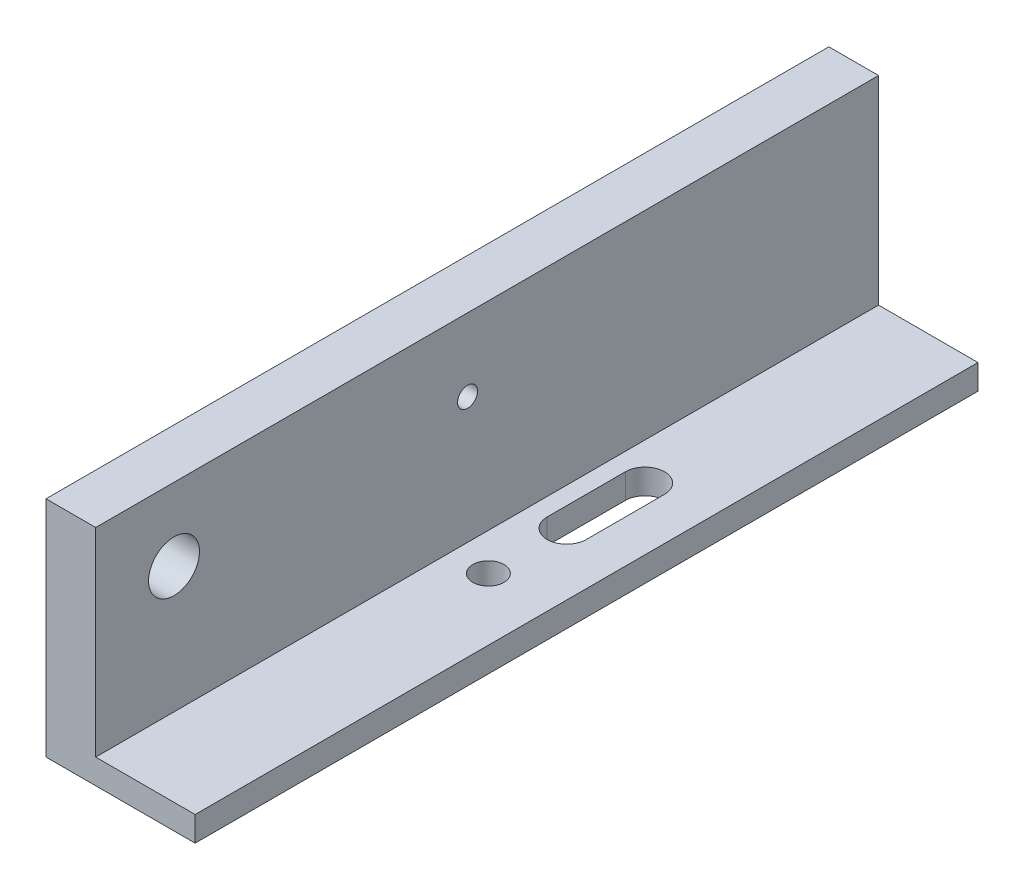
ISO-10303-21;
HEADER;
FILE_DESCRIPTION(('STEP AP214'),'2;1');
FILE_NAME('part.step','',(''),(''),'','','');
FILE_SCHEMA(('AUTOMOTIVE_DESIGN { 1 0 10303 214 1 1 1 1 }'));
ENDSEC;
DATA;
#1=APPLICATION_CONTEXT('core data for automotive mechanical design processes');
#2=APPLICATION_PROTOCOL_DEFINITION('international standard','automotive_design',2000,#1);
#3=PRODUCT_CONTEXT('',#1,'mechanical');
#4=PRODUCT('Part','Part','',(#3));
#5=PRODUCT_RELATED_PRODUCT_CATEGORY('part','',(#4));
#6=PRODUCT_DEFINITION_FORMATION('','',#4);
#7=PRODUCT_DEFINITION_CONTEXT('part definition',#1,'design');
#8=PRODUCT_DEFINITION('design','',#6,#7);
#9=PRODUCT_DEFINITION_SHAPE('','',#8);
#10=(LENGTH_UNIT() NAMED_UNIT(*) SI_UNIT(.MILLI.,.METRE.));
#11=(NAMED_UNIT(*) PLANE_ANGLE_UNIT() SI_UNIT($,.RADIAN.));
#12=(NAMED_UNIT(*) SI_UNIT($,.STERADIAN.) SOLID_ANGLE_UNIT());
#13=UNCERTAINTY_MEASURE_WITH_UNIT(LENGTH_MEASURE(1.E-05),#10,'distance_accuracy_value','');
#14=(GEOMETRIC_REPRESENTATION_CONTEXT(3) GLOBAL_UNCERTAINTY_ASSIGNED_CONTEXT((#13)) GLOBAL_UNIT_ASSIGNED_CONTEXT((#10,
#11,#12)) REPRESENTATION_CONTEXT('',''));
#15=CARTESIAN_POINT('',(0.,0.,0.));
#16=DIRECTION('',(0.,0.,1.));
#17=DIRECTION('',(1.,0.,0.));
#18=AXIS2_PLACEMENT_3D('',#15,#16,#17);
#19=CARTESIAN_POINT('',(0.,0.,100.));
#20=DIRECTION('',(1.,0.,0.));
#21=DIRECTION('',(0.,1.,0.));
#22=AXIS2_PLACEMENT_3D('',#19,#20,#21);
#23=PLANE('',#22);
#24=CARTESIAN_POINT('',(0.,10.,4.9999999999997));
#25=DIRECTION('',(1.,0.,0.));
#26=DIRECTION('',(0.,1.,0.));
#27=AXIS2_PLACEMENT_3D('',#24,#25,#26);
#28=CIRCLE('',#27,2.55269999999999);
#29=CARTESIAN_POINT('',(0.,12.5527,4.9999999999997));
#30=VERTEX_POINT('',#29);
#31=EDGE_CURVE('E307',#30,#30,#28,.T.);
#32=ORIENTED_EDGE('',*,*,#31,.T.);
#33=EDGE_LOOP('',(#32));
#34=FACE_BOUND('',#33,.T.);
#35=CARTESIAN_POINT('',(0.,10.,80.));
#36=DIRECTION('',(-1.,0.,0.));
#37=DIRECTION('',(0.,-1.,0.));
#38=AXIS2_PLACEMENT_3D('',#35,#36,#37);
#39=CIRCLE('',#38,6.5);
#40=CARTESIAN_POINT('',(0.,3.5,80.));
#41=VERTEX_POINT('',#40);
#42=EDGE_CURVE('E172',#41,#41,#39,.T.);
#43=ORIENTED_EDGE('',*,*,#42,.F.);
#44=EDGE_LOOP('',(#43));
#45=FACE_BOUND('',#44,.T.);
#46=DIRECTION('',(0.,-1.,0.));
#47=VECTOR('',#46,1.);
#48=CARTESIAN_POINT('',(0.,6.35,-50.));
#49=LINE('',#48,#47);
#50=CARTESIAN_POINT('',(0.,6.35,-50.));
#51=VERTEX_POINT('',#50);
#52=CARTESIAN_POINT('',(0.,-6.35,-50.));
#53=VERTEX_POINT('',#52);
#54=EDGE_CURVE('E200',#51,#53,#49,.T.);
#55=ORIENTED_EDGE('',*,*,#54,.F.);
#56=DIRECTION('',(0.,0.,-1.));
#57=VECTOR('',#56,1.);
#58=CARTESIAN_POINT('',(0.,6.35,-50.));
#59=LINE('',#58,#57);
#60=CARTESIAN_POINT('',(0.,6.35,50.));
#61=VERTEX_POINT('',#60);
#62=EDGE_CURVE('E197',#61,#51,#59,.T.);
#63=ORIENTED_EDGE('',*,*,#62,.F.);
#64=DIRECTION('',(0.,-1.,0.));
#65=VECTOR('',#64,1.);
#66=CARTESIAN_POINT('',(0.,6.35,50.));
#67=LINE('',#66,#65);
#68=CARTESIAN_POINT('',(0.,-6.35,50.));
#69=VERTEX_POINT('',#68);
#70=EDGE_CURVE('E211',#61,#69,#67,.T.);
#71=ORIENTED_EDGE('',*,*,#70,.T.);
#72=DIRECTION('',(0.,0.,-1.));
#73=VECTOR('',#72,1.);
#74=CARTESIAN_POINT('',(0.,-6.35,-50.));
#75=LINE('',#74,#73);
#76=EDGE_CURVE('E192',#69,#53,#75,.T.);
#77=ORIENTED_EDGE('',*,*,#76,.T.);
#78=EDGE_LOOP('',(#55,#63,#71,#77));
#79=FACE_BOUND('',#78,.T.);
#80=DIRECTION('',(0.,-1.,0.));
#81=VECTOR('',#80,1.);
#82=CARTESIAN_POINT('',(0.,0.,-100.));
#83=LINE('',#82,#81);
#84=CARTESIAN_POINT('',(0.,28.575,-100.));
#85=VERTEX_POINT('',#84);
#86=CARTESIAN_POINT('',(0.,-28.575,-100.));
#87=VERTEX_POINT('',#86);
#88=EDGE_CURVE('E219',#85,#87,#83,.T.);
#89=ORIENTED_EDGE('',*,*,#88,.T.);
#90=DIRECTION('',(0.,0.,-1.));
#91=VECTOR('',#90,1.);
#92=CARTESIAN_POINT('',(0.,-28.575,100.));
#93=LINE('',#92,#91);
#94=CARTESIAN_POINT('',(0.,-28.575,100.));
#95=VERTEX_POINT('',#94);
#96=EDGE_CURVE('E11',#95,#87,#93,.T.);
#97=ORIENTED_EDGE('',*,*,#96,.F.);
#98=DIRECTION('',(0.,-1.,0.));
#99=VECTOR('',#98,1.);
#100=CARTESIAN_POINT('',(0.,0.,100.));
#101=LINE('',#100,#99);
#102=CARTESIAN_POINT('',(0.,28.575,100.));
#103=VERTEX_POINT('',#102);
#104=EDGE_CURVE('E220',#103,#95,#101,.T.);
#105=ORIENTED_EDGE('',*,*,#104,.F.);
#106=DIRECTION('',(0.,0.,-1.));
#107=VECTOR('',#106,1.);
#108=CARTESIAN_POINT('',(0.,28.575,100.));
#109=LINE('',#108,#107);
#110=EDGE_CURVE('E236',#103,#85,#109,.T.);
#111=ORIENTED_EDGE('',*,*,#110,.T.);
#112=EDGE_LOOP('',(#89,#97,#105,#111));
#113=FACE_BOUND('',#112,.T.);
#114=ADVANCED_FACE('F37',(#34,#45,#79,#113),#23,.F.);
#115=CARTESIAN_POINT('',(0.,-28.575,100.));
#116=DIRECTION('',(0.,1.,0.));
#117=DIRECTION('',(-1.,0.,0.));
#118=AXIS2_PLACEMENT_3D('',#115,#116,#117);
#119=PLANE('',#118);
#120=CARTESIAN_POINT('',(22.225,-28.575,9.20496048384081));
#121=DIRECTION('',(0.,-1.,0.));
#122=DIRECTION('',(0.,0.,-1.));
#123=AXIS2_PLACEMENT_3D('',#120,#121,#122);
#124=CIRCLE('',#123,3.96874999999999);
#125=CARTESIAN_POINT('',(22.225,-28.575,5.23621048384083));
#126=VERTEX_POINT('',#125);
#127=EDGE_CURVE('E504',#126,#126,#124,.T.);
#128=ORIENTED_EDGE('',*,*,#127,.F.);
#129=EDGE_LOOP('',(#128));
#130=FACE_BOUND('',#129,.T.);
#131=DIRECTION('',(0.,0.,-1.));
#132=VECTOR('',#131,1.);
#133=CARTESIAN_POINT('',(17.225,-28.575,-10.7950395161592));
#134=LINE('',#133,#132);
#135=CARTESIAN_POINT('',(17.225,-28.575,-10.7950395161592));
#136=VERTEX_POINT('',#135);
#137=CARTESIAN_POINT('',(17.225,-28.575,-30.7900760584101));
#138=VERTEX_POINT('',#137);
#139=EDGE_CURVE('E154',#136,#138,#134,.T.);
#140=ORIENTED_EDGE('',*,*,#139,.F.);
#141=CARTESIAN_POINT('',(22.225,-28.575,-10.7950395161592));
#142=DIRECTION('',(0.,-1.,0.));
#143=DIRECTION('',(1.,0.,0.));
#144=AXIS2_PLACEMENT_3D('',#141,#142,#143);
#145=CIRCLE('',#144,5.);
#146=CARTESIAN_POINT('',(27.225,-28.575,-10.7950395161592));
#147=VERTEX_POINT('',#146);
#148=EDGE_CURVE('E53',#147,#136,#145,.T.);
#149=ORIENTED_EDGE('',*,*,#148,.F.);
#150=DIRECTION('',(0.,0.,1.));
#151=VECTOR('',#150,1.);
#152=CARTESIAN_POINT('',(27.225,-28.575,-10.7950395161592));
#153=LINE('',#152,#151);
#154=CARTESIAN_POINT('',(27.225,-28.575,-30.7900760584101));
#155=VERTEX_POINT('',#154);
#156=EDGE_CURVE('E161',#155,#147,#153,.T.);
#157=ORIENTED_EDGE('',*,*,#156,.F.);
#158=CARTESIAN_POINT('',(22.225,-28.575,-30.7900760584101));
#159=DIRECTION('',(0.,-1.,0.));
#160=DIRECTION('',(1.,0.,0.));
#161=AXIS2_PLACEMENT_3D('',#158,#159,#160);
#162=CIRCLE('',#161,5.);
#163=EDGE_CURVE('E145',#138,#155,#162,.T.);
#164=ORIENTED_EDGE('',*,*,#163,.F.);
#165=EDGE_LOOP('',(#140,#149,#157,#164));
#166=FACE_BOUND('',#165,.T.);
#167=DIRECTION('',(1.,0.,0.));
#168=VECTOR('',#167,1.);
#169=CARTESIAN_POINT('',(0.,-28.575,-100.));
#170=LINE('',#169,#168);
#171=CARTESIAN_POINT('',(38.1,-28.575,-100.));
#172=VERTEX_POINT('',#171);
#173=EDGE_CURVE('E239',#87,#172,#170,.T.);
#174=ORIENTED_EDGE('',*,*,#173,.T.);
#175=DIRECTION('',(0.,0.,-1.));
#176=VECTOR('',#175,1.);
#177=CARTESIAN_POINT('',(38.1,-28.575,100.));
#178=LINE('',#177,#176);
#179=CARTESIAN_POINT('',(38.1,-28.575,100.));
#180=VERTEX_POINT('',#179);
#181=EDGE_CURVE('E45',#180,#172,#178,.T.);
#182=ORIENTED_EDGE('',*,*,#181,.F.);
#183=DIRECTION('',(1.,0.,0.));
#184=VECTOR('',#183,1.);
#185=CARTESIAN_POINT('',(0.,-28.575,100.));
#186=LINE('',#185,#184);
#187=EDGE_CURVE('E223',#95,#180,#186,.T.);
#188=ORIENTED_EDGE('',*,*,#187,.F.);
#189=ORIENTED_EDGE('',*,*,#96,.T.);
#190=EDGE_LOOP('',(#174,#182,#188,#189));
#191=FACE_BOUND('',#190,.T.);
#192=ADVANCED_FACE('F158',(#130,#166,#191),#119,.F.);
#193=CARTESIAN_POINT('',(38.1,0.,100.));
#194=DIRECTION('',(-1.,0.,0.));
#195=DIRECTION('',(0.,0.,1.));
#196=AXIS2_PLACEMENT_3D('',#193,#194,#195);
#197=PLANE('',#196);
#198=DIRECTION('',(0.,1.,0.));
#199=VECTOR('',#198,1.);
#200=CARTESIAN_POINT('',(38.1,0.,-100.));
#201=LINE('',#200,#199);
#202=CARTESIAN_POINT('',(38.1,-22.225,-100.));
#203=VERTEX_POINT('',#202);
#204=EDGE_CURVE('E241',#172,#203,#201,.T.);
#205=ORIENTED_EDGE('',*,*,#204,.T.);
#206=DIRECTION('',(0.,0.,-1.));
#207=VECTOR('',#206,1.);
#208=CARTESIAN_POINT('',(38.1,-22.225,100.));
#209=LINE('',#208,#207);
#210=CARTESIAN_POINT('',(38.1,-22.225,100.));
#211=VERTEX_POINT('',#210);
#212=EDGE_CURVE('E256',#211,#203,#209,.T.);
#213=ORIENTED_EDGE('',*,*,#212,.F.);
#214=DIRECTION('',(0.,1.,0.));
#215=VECTOR('',#214,1.);
#216=CARTESIAN_POINT('',(38.1,0.,100.));
#217=LINE('',#216,#215);
#218=EDGE_CURVE('E226',#180,#211,#217,.T.);
#219=ORIENTED_EDGE('',*,*,#218,.F.);
#220=ORIENTED_EDGE('',*,*,#181,.T.);
#221=EDGE_LOOP('',(#205,#213,#219,#220));
#222=FACE_BOUND('',#221,.T.);
#223=ADVANCED_FACE('F295',(#222),#197,.F.);
#224=CARTESIAN_POINT('',(0.,-22.225,100.));
#225=DIRECTION('',(0.,-1.,0.));
#226=DIRECTION('',(1.,0.,0.));
#227=AXIS2_PLACEMENT_3D('',#224,#225,#226);
#228=PLANE('',#227);
#229=CARTESIAN_POINT('',(22.225,-22.225,9.20496048384081));
#230=DIRECTION('',(0.,-1.,0.));
#231=DIRECTION('',(1.,0.,0.));
#232=AXIS2_PLACEMENT_3D('',#229,#230,#231);
#233=CIRCLE('',#232,3.96874999999999);
#234=CARTESIAN_POINT('',(26.19375,-22.225,9.20496048384081));
#235=VERTEX_POINT('',#234);
#236=EDGE_CURVE('E40',#235,#235,#233,.T.);
#237=ORIENTED_EDGE('',*,*,#236,.T.);
#238=EDGE_LOOP('',(#237));
#239=FACE_BOUND('',#238,.T.);
#240=DIRECTION('',(0.,0.,-1.));
#241=VECTOR('',#240,1.);
#242=CARTESIAN_POINT('',(27.225,-22.225,-10.7950395161592));
#243=LINE('',#242,#241);
#244=CARTESIAN_POINT('',(27.225,-22.225,-10.7950395161592));
#245=VERTEX_POINT('',#244);
#246=CARTESIAN_POINT('',(27.225,-22.225,-30.7900760584101));
#247=VERTEX_POINT('',#246);
#248=EDGE_CURVE('E514',#245,#247,#243,.T.);
#249=ORIENTED_EDGE('',*,*,#248,.F.);
#250=CARTESIAN_POINT('',(22.225,-22.225,-10.7950395161592));
#251=DIRECTION('',(0.,-1.,0.));
#252=DIRECTION('',(1.,0.,0.));
#253=AXIS2_PLACEMENT_3D('',#250,#251,#252);
#254=CIRCLE('',#253,5.);
#255=CARTESIAN_POINT('',(17.225,-22.225,-10.7950395161592));
#256=VERTEX_POINT('',#255);
#257=EDGE_CURVE('E173',#256,#245,#254,.F.);
#258=ORIENTED_EDGE('',*,*,#257,.F.);
#259=DIRECTION('',(0.,0.,1.));
#260=VECTOR('',#259,1.);
#261=CARTESIAN_POINT('',(17.225,-22.225,-10.7950395161592));
#262=LINE('',#261,#260);
#263=CARTESIAN_POINT('',(17.225,-22.225,-30.7900760584101));
#264=VERTEX_POINT('',#263);
#265=EDGE_CURVE('E170',#264,#256,#262,.T.);
#266=ORIENTED_EDGE('',*,*,#265,.F.);
#267=CARTESIAN_POINT('',(22.225,-22.225,-30.7900760584101));
#268=DIRECTION('',(0.,-1.,0.));
#269=DIRECTION('',(1.,0.,0.));
#270=AXIS2_PLACEMENT_3D('',#267,#268,#269);
#271=CIRCLE('',#270,5.);
#272=EDGE_CURVE('E148',#247,#264,#271,.F.);
#273=ORIENTED_EDGE('',*,*,#272,.F.);
#274=EDGE_LOOP('',(#249,#258,#266,#273));
#275=FACE_BOUND('',#274,.T.);
#276=DIRECTION('',(-1.,0.,0.));
#277=VECTOR('',#276,1.);
#278=CARTESIAN_POINT('',(0.,-22.225,-100.));
#279=LINE('',#278,#277);
#280=CARTESIAN_POINT('',(12.7,-22.225,-100.));
#281=VERTEX_POINT('',#280);
#282=EDGE_CURVE('E243',#203,#281,#279,.T.);
#283=ORIENTED_EDGE('',*,*,#282,.T.);
#284=DIRECTION('',(0.,0.,-1.));
#285=VECTOR('',#284,1.);
#286=CARTESIAN_POINT('',(12.7,-22.225,100.));
#287=LINE('',#286,#285);
#288=CARTESIAN_POINT('',(12.7,-22.225,100.));
#289=VERTEX_POINT('',#288);
#290=EDGE_CURVE('E254',#289,#281,#287,.T.);
#291=ORIENTED_EDGE('',*,*,#290,.F.);
#292=DIRECTION('',(-1.,0.,0.));
#293=VECTOR('',#292,1.);
#294=CARTESIAN_POINT('',(0.,-22.225,100.));
#295=LINE('',#294,#293);
#296=EDGE_CURVE('E228',#211,#289,#295,.T.);
#297=ORIENTED_EDGE('',*,*,#296,.F.);
#298=ORIENTED_EDGE('',*,*,#212,.T.);
#299=EDGE_LOOP('',(#283,#291,#297,#298));
#300=FACE_BOUND('',#299,.T.);
#301=ADVANCED_FACE('F272',(#239,#275,#300),#228,.F.);
#302=CARTESIAN_POINT('',(12.7,0.,100.));
#303=DIRECTION('',(1.,0.,0.));
#304=DIRECTION('',(0.,1.,0.));
#305=AXIS2_PLACEMENT_3D('',#302,#303,#304);
#306=PLANE('',#305);
#307=CARTESIAN_POINT('',(12.7,10.,4.9999999999997));
#308=DIRECTION('',(1.,0.,0.));
#309=DIRECTION('',(0.,0.,-1.));
#310=AXIS2_PLACEMENT_3D('',#307,#308,#309);
#311=CIRCLE('',#310,2.55269999999999);
#312=CARTESIAN_POINT('',(12.7,10.,2.44729999999971));
#313=VERTEX_POINT('',#312);
#314=EDGE_CURVE('E507',#313,#313,#311,.T.);
#315=ORIENTED_EDGE('',*,*,#314,.F.);
#316=EDGE_LOOP('',(#315));
#317=FACE_BOUND('',#316,.T.);
#318=CARTESIAN_POINT('',(12.7,10.,80.));
#319=DIRECTION('',(1.,0.,0.));
#320=DIRECTION('',(0.,1.,0.));
#321=AXIS2_PLACEMENT_3D('',#318,#319,#320);
#322=CIRCLE('',#321,6.5);
#323=CARTESIAN_POINT('',(12.7,16.5,80.));
#324=VERTEX_POINT('',#323);
#325=EDGE_CURVE('E176',#324,#324,#322,.T.);
#326=ORIENTED_EDGE('',*,*,#325,.F.);
#327=EDGE_LOOP('',(#326));
#328=FACE_BOUND('',#327,.T.);
#329=DIRECTION('',(0.,-1.,0.));
#330=VECTOR('',#329,1.);
#331=CARTESIAN_POINT('',(12.7,0.,-100.));
#332=LINE('',#331,#330);
#333=CARTESIAN_POINT('',(12.7,28.575,-100.));
#334=VERTEX_POINT('',#333);
#335=EDGE_CURVE('E246',#334,#281,#332,.T.);
#336=ORIENTED_EDGE('',*,*,#335,.F.);
#337=DIRECTION('',(0.,0.,-1.));
#338=VECTOR('',#337,1.);
#339=CARTESIAN_POINT('',(12.7,28.575,100.));
#340=LINE('',#339,#338);
#341=CARTESIAN_POINT('',(12.7,28.575,100.));
#342=VERTEX_POINT('',#341);
#343=EDGE_CURVE('E252',#342,#334,#340,.T.);
#344=ORIENTED_EDGE('',*,*,#343,.F.);
#345=DIRECTION('',(0.,-1.,0.));
#346=VECTOR('',#345,1.);
#347=CARTESIAN_POINT('',(12.7,0.,100.));
#348=LINE('',#347,#346);
#349=EDGE_CURVE('E230',#342,#289,#348,.T.);
#350=ORIENTED_EDGE('',*,*,#349,.T.);
#351=ORIENTED_EDGE('',*,*,#290,.T.);
#352=EDGE_LOOP('',(#336,#344,#350,#351));
#353=FACE_BOUND('',#352,.T.);
#354=ADVANCED_FACE('F268',(#317,#328,#353),#306,.T.);
#355=CARTESIAN_POINT('',(0.,28.575,100.));
#356=DIRECTION('',(0.,1.,0.));
#357=DIRECTION('',(0.,0.,1.));
#358=AXIS2_PLACEMENT_3D('',#355,#356,#357);
#359=PLANE('',#358);
#360=DIRECTION('',(1.,0.,0.));
#361=VECTOR('',#360,1.);
#362=CARTESIAN_POINT('',(0.,28.575,-100.));
#363=LINE('',#362,#361);
#364=EDGE_CURVE('E224',#85,#334,#363,.T.);
#365=ORIENTED_EDGE('',*,*,#364,.F.);
#366=ORIENTED_EDGE('',*,*,#110,.F.);
#367=DIRECTION('',(1.,0.,0.));
#368=VECTOR('',#367,1.);
#369=CARTESIAN_POINT('',(0.,28.575,100.));
#370=LINE('',#369,#368);
#371=EDGE_CURVE('E233',#103,#342,#370,.T.);
#372=ORIENTED_EDGE('',*,*,#371,.T.);
#373=ORIENTED_EDGE('',*,*,#343,.T.);
#374=EDGE_LOOP('',(#365,#366,#372,#373));
#375=FACE_BOUND('',#374,.T.);
#376=ADVANCED_FACE('F271',(#375),#359,.T.);
#377=CARTESIAN_POINT('',(0.,0.,100.));
#378=DIRECTION('',(0.,0.,1.));
#379=DIRECTION('',(1.,0.,0.));
#380=AXIS2_PLACEMENT_3D('',#377,#378,#379);
#381=PLANE('',#380);
#382=ORIENTED_EDGE('',*,*,#104,.T.);
#383=ORIENTED_EDGE('',*,*,#187,.T.);
#384=ORIENTED_EDGE('',*,*,#218,.T.);
#385=ORIENTED_EDGE('',*,*,#296,.T.);
#386=ORIENTED_EDGE('',*,*,#349,.F.);
#387=ORIENTED_EDGE('',*,*,#371,.F.);
#388=EDGE_LOOP('',(#382,#383,#384,#385,#386,#387));
#389=FACE_BOUND('',#388,.T.);
#390=ADVANCED_FACE('F287',(#389),#381,.T.);
#391=CARTESIAN_POINT('',(0.,0.,-100.));
#392=DIRECTION('',(0.,0.,1.));
#393=DIRECTION('',(1.,0.,0.));
#394=AXIS2_PLACEMENT_3D('',#391,#392,#393);
#395=PLANE('',#394);
#396=ORIENTED_EDGE('',*,*,#88,.F.);
#397=ORIENTED_EDGE('',*,*,#364,.T.);
#398=ORIENTED_EDGE('',*,*,#335,.T.);
#399=ORIENTED_EDGE('',*,*,#282,.F.);
#400=ORIENTED_EDGE('',*,*,#204,.F.);
#401=ORIENTED_EDGE('',*,*,#173,.F.);
#402=EDGE_LOOP('',(#396,#397,#398,#399,#400,#401));
#403=FACE_BOUND('',#402,.T.);
#404=ADVANCED_FACE('F282',(#403),#395,.F.);
#405=CARTESIAN_POINT('',(-19.05,6.35,-30.9499999999998));
#406=DIRECTION('',(0.707106781186552,0.,0.707106781186543));
#407=DIRECTION('',(0.707106781186543,0.,-0.707106781186552));
#408=AXIS2_PLACEMENT_3D('',#405,#406,#407);
#409=PLANE('',#408);
#410=CARTESIAN_POINT('',(-9.525,0.,-40.4749999999999));
#411=DIRECTION('',(0.707106781186552,0.,0.707106781186543));
#412=DIRECTION('',(-0.707106781186543,0.,0.707106781186552));
#413=AXIS2_PLACEMENT_3D('',#410,#411,#412);
#414=ELLIPSE('',#413,3.61006296066979,2.55269999999998);
#415=CARTESIAN_POINT('',(-12.0777,0.,-37.9222999999999));
#416=VERTEX_POINT('',#415);
#417=EDGE_CURVE('E184',#416,#416,#414,.T.);
#418=ORIENTED_EDGE('',*,*,#417,.T.);
#419=EDGE_LOOP('',(#418));
#420=FACE_BOUND('',#419,.T.);
#421=DIRECTION('',(-0.707106781186543,0.,0.707106781186552));
#422=VECTOR('',#421,1.);
#423=CARTESIAN_POINT('',(-19.05,-6.35,-30.9499999999998));
#424=LINE('',#423,#422);
#425=CARTESIAN_POINT('',(-19.05,-6.35,-30.9499999999998));
#426=VERTEX_POINT('',#425);
#427=EDGE_CURVE('E187',#53,#426,#424,.T.);
#428=ORIENTED_EDGE('',*,*,#427,.T.);
#429=DIRECTION('',(0.,-1.,0.));
#430=VECTOR('',#429,1.);
#431=CARTESIAN_POINT('',(-19.05,6.35,-30.9499999999998));
#432=LINE('',#431,#430);
#433=CARTESIAN_POINT('',(-19.05,6.35,-30.9499999999998));
#434=VERTEX_POINT('',#433);
#435=EDGE_CURVE('E216',#434,#426,#432,.T.);
#436=ORIENTED_EDGE('',*,*,#435,.F.);
#437=DIRECTION('',(-0.707106781186543,0.,0.707106781186552));
#438=VECTOR('',#437,1.);
#439=CARTESIAN_POINT('',(-19.05,6.35,-30.9499999999998));
#440=LINE('',#439,#438);
#441=EDGE_CURVE('E188',#51,#434,#440,.T.);
#442=ORIENTED_EDGE('',*,*,#441,.F.);
#443=ORIENTED_EDGE('',*,*,#54,.T.);
#444=EDGE_LOOP('',(#428,#436,#442,#443));
#445=FACE_BOUND('',#444,.T.);
#446=ADVANCED_FACE('F319',(#420,#445),#409,.F.);
#447=CARTESIAN_POINT('',(-19.05,6.35,30.9500000000732));
#448=DIRECTION('',(1.,0.,0.));
#449=DIRECTION('',(0.,0.,-1.));
#450=AXIS2_PLACEMENT_3D('',#447,#448,#449);
#451=PLANE('',#450);
#452=CARTESIAN_POINT('',(-19.05,0.,0.));
#453=DIRECTION('',(-1.,0.,0.));
#454=DIRECTION('',(0.,0.,1.));
#455=AXIS2_PLACEMENT_3D('',#452,#453,#454);
#456=CIRCLE('',#455,1.7272);
#457=CARTESIAN_POINT('',(-19.05,0.,1.7272));
#458=VERTEX_POINT('',#457);
#459=EDGE_CURVE('E177',#458,#458,#456,.T.);
#460=ORIENTED_EDGE('',*,*,#459,.F.);
#461=EDGE_LOOP('',(#460));
#462=FACE_BOUND('',#461,.T.);
#463=DIRECTION('',(0.,0.,1.));
#464=VECTOR('',#463,1.);
#465=CARTESIAN_POINT('',(-19.05,-6.35,30.9500000000732));
#466=LINE('',#465,#464);
#467=CARTESIAN_POINT('',(-19.05,-6.35,30.9500000000732));
#468=VERTEX_POINT('',#467);
#469=EDGE_CURVE('E203',#426,#468,#466,.T.);
#470=ORIENTED_EDGE('',*,*,#469,.T.);
#471=DIRECTION('',(0.,-1.,0.));
#472=VECTOR('',#471,1.);
#473=CARTESIAN_POINT('',(-19.05,6.35,30.9500000000732));
#474=LINE('',#473,#472);
#475=CARTESIAN_POINT('',(-19.05,6.35,30.9500000000732));
#476=VERTEX_POINT('',#475);
#477=EDGE_CURVE('E213',#476,#468,#474,.T.);
#478=ORIENTED_EDGE('',*,*,#477,.F.);
#479=DIRECTION('',(0.,0.,1.));
#480=VECTOR('',#479,1.);
#481=CARTESIAN_POINT('',(-19.05,6.35,30.9500000000732));
#482=LINE('',#481,#480);
#483=EDGE_CURVE('E191',#434,#476,#482,.T.);
#484=ORIENTED_EDGE('',*,*,#483,.F.);
#485=ORIENTED_EDGE('',*,*,#435,.T.);
#486=EDGE_LOOP('',(#470,#478,#484,#485));
#487=FACE_BOUND('',#486,.T.);
#488=ADVANCED_FACE('F321',(#462,#487),#451,.F.);
#489=CARTESIAN_POINT('',(0.,6.35,50.));
#490=DIRECTION('',(0.707106781185188,0.,-0.707106781187907));
#491=DIRECTION('',(-0.707106781187907,0.,-0.707106781185188));
#492=AXIS2_PLACEMENT_3D('',#489,#490,#491);
#493=PLANE('',#492);
#494=CARTESIAN_POINT('',(-9.525,0.,40.4750000000366));
#495=DIRECTION('',(0.707106781185188,0.,-0.707106781187907));
#496=DIRECTION('',(0.707106781187907,0.,0.707106781185188));
#497=AXIS2_PLACEMENT_3D('',#494,#495,#496);
#498=ELLIPSE('',#497,3.61006296066283,2.55269999999998);
#499=CARTESIAN_POINT('',(-6.97230000000002,0.,43.0277000000268));
#500=VERTEX_POINT('',#499);
#501=EDGE_CURVE('E183',#500,#500,#498,.T.);
#502=ORIENTED_EDGE('',*,*,#501,.T.);
#503=EDGE_LOOP('',(#502));
#504=FACE_BOUND('',#503,.T.);
#505=DIRECTION('',(0.707106781187907,0.,0.707106781185188));
#506=VECTOR('',#505,1.);
#507=CARTESIAN_POINT('',(0.,-6.35,50.));
#508=LINE('',#507,#506);
#509=EDGE_CURVE('E205',#468,#69,#508,.T.);
#510=ORIENTED_EDGE('',*,*,#509,.T.);
#511=ORIENTED_EDGE('',*,*,#70,.F.);
#512=DIRECTION('',(0.707106781187907,0.,0.707106781185188));
#513=VECTOR('',#512,1.);
#514=CARTESIAN_POINT('',(0.,6.35,50.));
#515=LINE('',#514,#513);
#516=EDGE_CURVE('E194',#476,#61,#515,.T.);
#517=ORIENTED_EDGE('',*,*,#516,.F.);
#518=ORIENTED_EDGE('',*,*,#477,.T.);
#519=EDGE_LOOP('',(#510,#511,#517,#518));
#520=FACE_BOUND('',#519,.T.);
#521=ADVANCED_FACE('F325',(#504,#520),#493,.F.);
#522=CARTESIAN_POINT('',(0.,6.35,0.));
#523=DIRECTION('',(0.,1.,0.));
#524=DIRECTION('',(0.,0.,1.));
#525=AXIS2_PLACEMENT_3D('',#522,#523,#524);
#526=PLANE('',#525);
#527=ORIENTED_EDGE('',*,*,#441,.T.);
#528=ORIENTED_EDGE('',*,*,#483,.T.);
#529=ORIENTED_EDGE('',*,*,#516,.T.);
#530=ORIENTED_EDGE('',*,*,#62,.T.);
#531=EDGE_LOOP('',(#527,#528,#529,#530));
#532=FACE_BOUND('',#531,.T.);
#533=ADVANCED_FACE('F315',(#532),#526,.T.);
#534=CARTESIAN_POINT('',(0.,-6.35,0.));
#535=DIRECTION('',(0.,1.,0.));
#536=DIRECTION('',(0.,0.,1.));
#537=AXIS2_PLACEMENT_3D('',#534,#535,#536);
#538=PLANE('',#537);
#539=ORIENTED_EDGE('',*,*,#427,.F.);
#540=ORIENTED_EDGE('',*,*,#76,.F.);
#541=ORIENTED_EDGE('',*,*,#509,.F.);
#542=ORIENTED_EDGE('',*,*,#469,.F.);
#543=EDGE_LOOP('',(#539,#540,#541,#542));
#544=FACE_BOUND('',#543,.T.);
#545=ADVANCED_FACE('F327',(#544),#538,.F.);
#546=CARTESIAN_POINT('',(-9.525,0.,50.));
#547=DIRECTION('',(0.,0.,1.));
#548=DIRECTION('',(1.,0.,0.));
#549=AXIS2_PLACEMENT_3D('',#546,#547,#548);
#550=CYLINDRICAL_SURFACE('',#549,2.55269999999998);
#551=ORIENTED_EDGE('',*,*,#501,.F.);
#552=EDGE_LOOP('',(#551));
#553=FACE_BOUND('',#552,.T.);
#554=ORIENTED_EDGE('',*,*,#417,.F.);
#555=EDGE_LOOP('',(#554));
#556=FACE_BOUND('',#555,.T.);
#557=ADVANCED_FACE('F329',(#553,#556),#550,.F.);
#558=CARTESIAN_POINT('',(-14.2875,0.,0.));
#559=DIRECTION('',(-1.,0.,0.));
#560=DIRECTION('',(0.,0.,1.));
#561=AXIS2_PLACEMENT_3D('',#558,#559,#560);
#562=CONICAL_SURFACE('',#561,1.7272,1.02974425867665);
#563=CARTESIAN_POINT('',(-13.2496935388156,0.,0.));
#564=VERTEX_POINT('',#563);
#565=VERTEX_LOOP('',#564);
#566=FACE_BOUND('',#565,.T.);
#567=CARTESIAN_POINT('',(-14.2875,0.,0.));
#568=DIRECTION('',(-1.,0.,0.));
#569=DIRECTION('',(0.,0.,1.));
#570=AXIS2_PLACEMENT_3D('',#567,#568,#569);
#571=CIRCLE('',#570,1.7272);
#572=CARTESIAN_POINT('',(-14.2875,0.,1.7272));
#573=VERTEX_POINT('',#572);
#574=EDGE_CURVE('E180',#573,#573,#571,.T.);
#575=ORIENTED_EDGE('',*,*,#574,.T.);
#576=EDGE_LOOP('',(#575));
#577=FACE_BOUND('',#576,.T.);
#578=ADVANCED_FACE('F335',(#566,#577),#562,.F.);
#579=CARTESIAN_POINT('',(-19.05,0.,0.));
#580=DIRECTION('',(-1.,0.,0.));
#581=DIRECTION('',(0.,0.,1.));
#582=AXIS2_PLACEMENT_3D('',#579,#580,#581);
#583=CYLINDRICAL_SURFACE('',#582,1.7272);
#584=ORIENTED_EDGE('',*,*,#574,.F.);
#585=EDGE_LOOP('',(#584));
#586=FACE_BOUND('',#585,.T.);
#587=ORIENTED_EDGE('',*,*,#459,.T.);
#588=EDGE_LOOP('',(#587));
#589=FACE_BOUND('',#588,.T.);
#590=ADVANCED_FACE('F421',(#586,#589),#583,.F.);
#591=CARTESIAN_POINT('',(38.1,10.,80.));
#592=DIRECTION('',(-1.,0.,0.));
#593=DIRECTION('',(0.,-1.,0.));
#594=AXIS2_PLACEMENT_3D('',#591,#592,#593);
#595=CYLINDRICAL_SURFACE('',#594,6.5);
#596=ORIENTED_EDGE('',*,*,#325,.T.);
#597=EDGE_LOOP('',(#596));
#598=FACE_BOUND('',#597,.T.);
#599=ORIENTED_EDGE('',*,*,#42,.T.);
#600=EDGE_LOOP('',(#599));
#601=FACE_BOUND('',#600,.T.);
#602=ADVANCED_FACE('F265',(#598,#601),#595,.F.);
#603=CARTESIAN_POINT('',(22.225,9.39306789117531,-10.7950395161592));
#604=DIRECTION('',(0.,-1.,0.));
#605=DIRECTION('',(1.,0.,0.));
#606=AXIS2_PLACEMENT_3D('',#603,#604,#605);
#607=CYLINDRICAL_SURFACE('',#606,5.);
#608=ORIENTED_EDGE('',*,*,#257,.T.);
#609=DIRECTION('',(0.,-1.,0.));
#610=VECTOR('',#609,1.);
#611=CARTESIAN_POINT('',(27.225,9.39306789117531,-10.7950395161592));
#612=LINE('',#611,#610);
#613=EDGE_CURVE('E166',#245,#147,#612,.T.);
#614=ORIENTED_EDGE('',*,*,#613,.T.);
#615=ORIENTED_EDGE('',*,*,#148,.T.);
#616=DIRECTION('',(0.,-1.,0.));
#617=VECTOR('',#616,1.);
#618=CARTESIAN_POINT('',(17.225,9.39306789117531,-10.7950395161592));
#619=LINE('',#618,#617);
#620=EDGE_CURVE('E151',#256,#136,#619,.T.);
#621=ORIENTED_EDGE('',*,*,#620,.F.);
#622=EDGE_LOOP('',(#608,#614,#615,#621));
#623=FACE_BOUND('',#622,.T.);
#624=ADVANCED_FACE('F438',(#623),#607,.F.);
#625=CARTESIAN_POINT('',(27.225,9.39306789117531,-10.7950395161592));
#626=DIRECTION('',(1.,0.,0.));
#627=DIRECTION('',(0.,0.,-1.));
#628=AXIS2_PLACEMENT_3D('',#625,#626,#627);
#629=PLANE('',#628);
#630=ORIENTED_EDGE('',*,*,#248,.T.);
#631=DIRECTION('',(0.,-1.,0.));
#632=VECTOR('',#631,1.);
#633=CARTESIAN_POINT('',(27.225,9.39306789117531,-30.7900760584101));
#634=LINE('',#633,#632);
#635=EDGE_CURVE('E150',#247,#155,#634,.T.);
#636=ORIENTED_EDGE('',*,*,#635,.T.);
#637=ORIENTED_EDGE('',*,*,#156,.T.);
#638=ORIENTED_EDGE('',*,*,#613,.F.);
#639=EDGE_LOOP('',(#630,#636,#637,#638));
#640=FACE_BOUND('',#639,.T.);
#641=ADVANCED_FACE('F446',(#640),#629,.F.);
#642=CARTESIAN_POINT('',(22.225,9.39306789117531,-30.7900760584101));
#643=DIRECTION('',(0.,-1.,0.));
#644=DIRECTION('',(1.,0.,0.));
#645=AXIS2_PLACEMENT_3D('',#642,#643,#644);
#646=CYLINDRICAL_SURFACE('',#645,5.);
#647=ORIENTED_EDGE('',*,*,#272,.T.);
#648=DIRECTION('',(0.,-1.,0.));
#649=VECTOR('',#648,1.);
#650=CARTESIAN_POINT('',(17.225,9.39306789117531,-30.7900760584101));
#651=LINE('',#650,#649);
#652=EDGE_CURVE('E61',#264,#138,#651,.T.);
#653=ORIENTED_EDGE('',*,*,#652,.T.);
#654=ORIENTED_EDGE('',*,*,#163,.T.);
#655=ORIENTED_EDGE('',*,*,#635,.F.);
#656=EDGE_LOOP('',(#647,#653,#654,#655));
#657=FACE_BOUND('',#656,.T.);
#658=ADVANCED_FACE('F142',(#657),#646,.F.);
#659=CARTESIAN_POINT('',(17.225,9.39306789117531,-10.7950395161592));
#660=DIRECTION('',(-1.,0.,0.));
#661=DIRECTION('',(0.,-1.,0.));
#662=AXIS2_PLACEMENT_3D('',#659,#660,#661);
#663=PLANE('',#662);
#664=ORIENTED_EDGE('',*,*,#265,.T.);
#665=ORIENTED_EDGE('',*,*,#620,.T.);
#666=ORIENTED_EDGE('',*,*,#139,.T.);
#667=ORIENTED_EDGE('',*,*,#652,.F.);
#668=EDGE_LOOP('',(#664,#665,#666,#667));
#669=FACE_BOUND('',#668,.T.);
#670=ADVANCED_FACE('F155',(#669),#663,.F.);
#671=CARTESIAN_POINT('',(12.7,10.,4.9999999999997));
#672=DIRECTION('',(1.,0.,0.));
#673=DIRECTION('',(0.,0.,-1.));
#674=AXIS2_PLACEMENT_3D('',#671,#672,#673);
#675=CYLINDRICAL_SURFACE('',#674,2.55269999999999);
#676=ORIENTED_EDGE('',*,*,#314,.T.);
#677=EDGE_LOOP('',(#676));
#678=FACE_BOUND('',#677,.T.);
#679=ORIENTED_EDGE('',*,*,#31,.F.);
#680=EDGE_LOOP('',(#679));
#681=FACE_BOUND('',#680,.T.);
#682=ADVANCED_FACE('F469',(#678,#681),#675,.F.);
#683=CARTESIAN_POINT('',(22.225,-28.575,9.20496048384081));
#684=DIRECTION('',(0.,-1.,0.));
#685=DIRECTION('',(0.,0.,-1.));
#686=AXIS2_PLACEMENT_3D('',#683,#684,#685);
#687=CYLINDRICAL_SURFACE('',#686,3.96874999999999);
#688=ORIENTED_EDGE('',*,*,#127,.T.);
#689=EDGE_LOOP('',(#688));
#690=FACE_BOUND('',#689,.T.);
#691=ORIENTED_EDGE('',*,*,#236,.F.);
#692=EDGE_LOOP('',(#691));
#693=FACE_BOUND('',#692,.T.);
#694=ADVANCED_FACE('F476',(#690,#693),#687,.F.);
#695=CLOSED_SHELL('',(#114,#192,#223,#301,#354,#376,#390,#404,#446,#488,#521,#533,#545,#557,
#578,#590,#602,#624,#641,#658,#670,#682,#694));
#696=MANIFOLD_SOLID_BREP('B2',#695);
#697=ADVANCED_BREP_SHAPE_REPRESENTATION('',(#18,#696),#14);
#698=SHAPE_DEFINITION_REPRESENTATION(#9,#697);
ENDSEC;
END-ISO-10303-21;
